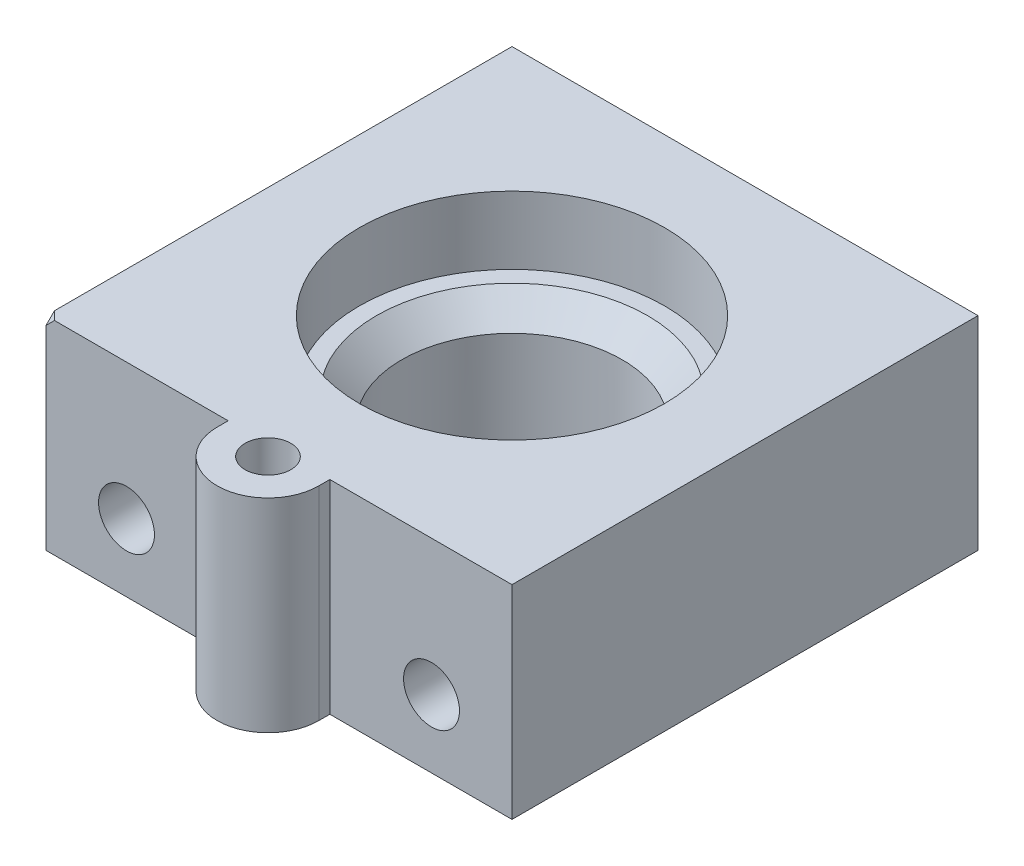
ISO-10303-21;
HEADER;
FILE_DESCRIPTION(('STEP AP214'),'2;1');
FILE_NAME('part.step','',(''),(''),'','','');
FILE_SCHEMA(('AUTOMOTIVE_DESIGN { 1 0 10303 214 1 1 1 1 }'));
ENDSEC;
DATA;
#1=APPLICATION_CONTEXT('core data for automotive mechanical design processes');
#2=APPLICATION_PROTOCOL_DEFINITION('international standard','automotive_design',2000,#1);
#3=PRODUCT_CONTEXT('',#1,'mechanical');
#4=PRODUCT('Part','Part','',(#3));
#5=PRODUCT_RELATED_PRODUCT_CATEGORY('part','',(#4));
#6=PRODUCT_DEFINITION_FORMATION('','',#4);
#7=PRODUCT_DEFINITION_CONTEXT('part definition',#1,'design');
#8=PRODUCT_DEFINITION('design','',#6,#7);
#9=PRODUCT_DEFINITION_SHAPE('','',#8);
#10=(LENGTH_UNIT() NAMED_UNIT(*) SI_UNIT(.MILLI.,.METRE.));
#11=(NAMED_UNIT(*) PLANE_ANGLE_UNIT() SI_UNIT($,.RADIAN.));
#12=(NAMED_UNIT(*) SI_UNIT($,.STERADIAN.) SOLID_ANGLE_UNIT());
#13=UNCERTAINTY_MEASURE_WITH_UNIT(LENGTH_MEASURE(1.E-05),#10,'distance_accuracy_value','');
#14=(GEOMETRIC_REPRESENTATION_CONTEXT(3) GLOBAL_UNCERTAINTY_ASSIGNED_CONTEXT((#13)) GLOBAL_UNIT_ASSIGNED_CONTEXT((#10,
#11,#12)) REPRESENTATION_CONTEXT('',''));
#15=CARTESIAN_POINT('',(0.,0.,0.));
#16=DIRECTION('',(0.,0.,1.));
#17=DIRECTION('',(1.,0.,0.));
#18=AXIS2_PLACEMENT_3D('',#15,#16,#17);
#19=CARTESIAN_POINT('',(-13.75,12.,13.75));
#20=DIRECTION('',(0.,0.,-1.));
#21=DIRECTION('',(-1.,0.,0.));
#22=AXIS2_PLACEMENT_3D('',#19,#20,#21);
#23=PLANE('',#22);
#24=CARTESIAN_POINT('',(-9.,4.,13.75));
#25=DIRECTION('',(0.,0.,1.));
#26=DIRECTION('',(1.,0.,0.));
#27=AXIS2_PLACEMENT_3D('',#24,#25,#26);
#28=CIRCLE('',#27,1.65);
#29=CARTESIAN_POINT('',(-7.35,4.,13.75));
#30=VERTEX_POINT('',#29);
#31=EDGE_CURVE('E143',#30,#30,#28,.T.);
#32=ORIENTED_EDGE('',*,*,#31,.F.);
#33=EDGE_LOOP('',(#32));
#34=FACE_BOUND('',#33,.T.);
#35=DIRECTION('',(0.,-1.,0.));
#36=VECTOR('',#35,1.);
#37=CARTESIAN_POINT('',(-3.,19.022997935355,13.75));
#38=LINE('',#37,#36);
#39=CARTESIAN_POINT('',(-3.,12.,13.75));
#40=VERTEX_POINT('',#39);
#41=CARTESIAN_POINT('',(-3.,0.,13.75));
#42=VERTEX_POINT('',#41);
#43=EDGE_CURVE('E139',#40,#42,#38,.T.);
#44=ORIENTED_EDGE('',*,*,#43,.F.);
#45=DIRECTION('',(1.,0.,0.));
#46=VECTOR('',#45,1.);
#47=CARTESIAN_POINT('',(-13.75,12.,13.75));
#48=LINE('',#47,#46);
#49=CARTESIAN_POINT('',(-13.25,12.,13.75));
#50=VERTEX_POINT('',#49);
#51=EDGE_CURVE('E174',#50,#40,#48,.T.);
#52=ORIENTED_EDGE('',*,*,#51,.F.);
#53=DIRECTION('',(0.707106781186547,0.707106781186547,0.));
#54=VECTOR('',#53,1.);
#55=CARTESIAN_POINT('',(-13.5,11.75,13.75));
#56=LINE('',#55,#54);
#57=CARTESIAN_POINT('',(-13.75,11.5,13.75));
#58=VERTEX_POINT('',#57);
#59=EDGE_CURVE('E43',#58,#50,#56,.T.);
#60=ORIENTED_EDGE('',*,*,#59,.F.);
#61=DIRECTION('',(0.,-1.,0.));
#62=VECTOR('',#61,1.);
#63=CARTESIAN_POINT('',(-13.75,12.,13.75));
#64=LINE('',#63,#62);
#65=CARTESIAN_POINT('',(-13.75,0.,13.75));
#66=VERTEX_POINT('',#65);
#67=EDGE_CURVE('E188',#58,#66,#64,.T.);
#68=ORIENTED_EDGE('',*,*,#67,.T.);
#69=DIRECTION('',(1.,0.,0.));
#70=VECTOR('',#69,1.);
#71=CARTESIAN_POINT('',(-13.75,0.,13.75));
#72=LINE('',#71,#70);
#73=EDGE_CURVE('E169',#66,#42,#72,.T.);
#74=ORIENTED_EDGE('',*,*,#73,.T.);
#75=EDGE_LOOP('',(#44,#52,#60,#68,#74));
#76=FACE_BOUND('',#75,.T.);
#77=ADVANCED_FACE('F35',(#34,#76),#23,.F.);
#78=CARTESIAN_POINT('',(13.75,12.,13.75));
#79=DIRECTION('',(-1.,0.,0.));
#80=DIRECTION('',(0.,0.,1.));
#81=AXIS2_PLACEMENT_3D('',#78,#79,#80);
#82=PLANE('',#81);
#83=DIRECTION('',(0.,0.,-1.));
#84=VECTOR('',#83,1.);
#85=CARTESIAN_POINT('',(13.75,0.,13.75));
#86=LINE('',#85,#84);
#87=CARTESIAN_POINT('',(13.75,0.,13.75));
#88=VERTEX_POINT('',#87);
#89=CARTESIAN_POINT('',(13.75,0.,-13.75));
#90=VERTEX_POINT('',#89);
#91=EDGE_CURVE('E162',#88,#90,#86,.T.);
#92=ORIENTED_EDGE('',*,*,#91,.T.);
#93=DIRECTION('',(0.,-1.,0.));
#94=VECTOR('',#93,1.);
#95=CARTESIAN_POINT('',(13.75,12.,-13.75));
#96=LINE('',#95,#94);
#97=CARTESIAN_POINT('',(13.75,12.,-13.75));
#98=VERTEX_POINT('',#97);
#99=EDGE_CURVE('E193',#98,#90,#96,.T.);
#100=ORIENTED_EDGE('',*,*,#99,.F.);
#101=DIRECTION('',(0.,0.,-1.));
#102=VECTOR('',#101,1.);
#103=CARTESIAN_POINT('',(13.75,12.,13.75));
#104=LINE('',#103,#102);
#105=CARTESIAN_POINT('',(13.75,12.,13.75));
#106=VERTEX_POINT('',#105);
#107=EDGE_CURVE('E165',#106,#98,#104,.T.);
#108=ORIENTED_EDGE('',*,*,#107,.F.);
#109=DIRECTION('',(0.,-1.,0.));
#110=VECTOR('',#109,1.);
#111=CARTESIAN_POINT('',(13.75,12.,13.75));
#112=LINE('',#111,#110);
#113=EDGE_CURVE('E176',#106,#88,#112,.T.);
#114=ORIENTED_EDGE('',*,*,#113,.T.);
#115=EDGE_LOOP('',(#92,#100,#108,#114));
#116=FACE_BOUND('',#115,.T.);
#117=ADVANCED_FACE('F232',(#116),#82,.F.);
#118=CARTESIAN_POINT('',(-13.75,12.,-13.75));
#119=DIRECTION('',(0.,0.,1.));
#120=DIRECTION('',(1.,0.,0.));
#121=AXIS2_PLACEMENT_3D('',#118,#119,#120);
#122=PLANE('',#121);
#123=CARTESIAN_POINT('',(-9.,4.,-13.75));
#124=DIRECTION('',(0.,0.,1.));
#125=DIRECTION('',(1.,0.,0.));
#126=AXIS2_PLACEMENT_3D('',#123,#124,#125);
#127=CIRCLE('',#126,1.65);
#128=CARTESIAN_POINT('',(-7.35,4.,-13.75));
#129=VERTEX_POINT('',#128);
#130=EDGE_CURVE('E146',#129,#129,#127,.F.);
#131=ORIENTED_EDGE('',*,*,#130,.F.);
#132=EDGE_LOOP('',(#131));
#133=FACE_BOUND('',#132,.T.);
#134=CARTESIAN_POINT('',(9.,4.,-13.75));
#135=DIRECTION('',(0.,0.,1.));
#136=DIRECTION('',(1.,0.,0.));
#137=AXIS2_PLACEMENT_3D('',#134,#135,#136);
#138=CIRCLE('',#137,1.65);
#139=CARTESIAN_POINT('',(10.65,4.,-13.75));
#140=VERTEX_POINT('',#139);
#141=EDGE_CURVE('E147',#140,#140,#138,.F.);
#142=ORIENTED_EDGE('',*,*,#141,.F.);
#143=EDGE_LOOP('',(#142));
#144=FACE_BOUND('',#143,.T.);
#145=DIRECTION('',(-1.,0.,0.));
#146=VECTOR('',#145,1.);
#147=CARTESIAN_POINT('',(-13.75,0.,-13.75));
#148=LINE('',#147,#146);
#149=CARTESIAN_POINT('',(-13.75,0.,-13.75));
#150=VERTEX_POINT('',#149);
#151=EDGE_CURVE('E179',#90,#150,#148,.T.);
#152=ORIENTED_EDGE('',*,*,#151,.T.);
#153=DIRECTION('',(0.,-1.,0.));
#154=VECTOR('',#153,1.);
#155=CARTESIAN_POINT('',(-13.75,12.,-13.75));
#156=LINE('',#155,#154);
#157=CARTESIAN_POINT('',(-13.75,12.,-13.75));
#158=VERTEX_POINT('',#157);
#159=EDGE_CURVE('E190',#158,#150,#156,.T.);
#160=ORIENTED_EDGE('',*,*,#159,.F.);
#161=DIRECTION('',(-1.,0.,0.));
#162=VECTOR('',#161,1.);
#163=CARTESIAN_POINT('',(-13.75,12.,-13.75));
#164=LINE('',#163,#162);
#165=EDGE_CURVE('E168',#98,#158,#164,.T.);
#166=ORIENTED_EDGE('',*,*,#165,.F.);
#167=ORIENTED_EDGE('',*,*,#99,.T.);
#168=EDGE_LOOP('',(#152,#160,#166,#167));
#169=FACE_BOUND('',#168,.T.);
#170=ADVANCED_FACE('F241',(#133,#144,#169),#122,.F.);
#171=CARTESIAN_POINT('',(-13.75,12.,13.75));
#172=DIRECTION('',(1.,0.,0.));
#173=DIRECTION('',(0.,0.,-1.));
#174=AXIS2_PLACEMENT_3D('',#171,#172,#173);
#175=PLANE('',#174);
#176=DIRECTION('',(0.,-0.707106781186547,0.707106781186547));
#177=VECTOR('',#176,1.);
#178=CARTESIAN_POINT('',(-13.75,11.75,13.5));
#179=LINE('',#178,#177);
#180=CARTESIAN_POINT('',(-13.75,12.,13.25));
#181=VERTEX_POINT('',#180);
#182=EDGE_CURVE('E202',#181,#58,#179,.T.);
#183=ORIENTED_EDGE('',*,*,#182,.F.);
#184=DIRECTION('',(0.,0.,1.));
#185=VECTOR('',#184,1.);
#186=CARTESIAN_POINT('',(-13.75,12.,13.75));
#187=LINE('',#186,#185);
#188=EDGE_CURVE('E171',#158,#181,#187,.T.);
#189=ORIENTED_EDGE('',*,*,#188,.F.);
#190=ORIENTED_EDGE('',*,*,#159,.T.);
#191=DIRECTION('',(0.,0.,1.));
#192=VECTOR('',#191,1.);
#193=CARTESIAN_POINT('',(-13.75,0.,13.75));
#194=LINE('',#193,#192);
#195=EDGE_CURVE('E181',#150,#66,#194,.T.);
#196=ORIENTED_EDGE('',*,*,#195,.T.);
#197=ORIENTED_EDGE('',*,*,#67,.F.);
#198=EDGE_LOOP('',(#183,#189,#190,#196,#197));
#199=FACE_BOUND('',#198,.T.);
#200=ADVANCED_FACE('F212',(#199),#175,.F.);
#201=CARTESIAN_POINT('',(3.,12.,13.75));
#202=VERTEX_POINT('',#201);
#203=EDGE_CURVE('E173',#202,#106,#48,.T.);
#204=ORIENTED_EDGE('',*,*,#203,.F.);
#205=DIRECTION('',(0.,-1.,0.));
#206=VECTOR('',#205,1.);
#207=CARTESIAN_POINT('',(3.,19.022997935355,13.75));
#208=LINE('',#207,#206);
#209=CARTESIAN_POINT('',(3.,0.,13.75));
#210=VERTEX_POINT('',#209);
#211=EDGE_CURVE('E112',#202,#210,#208,.T.);
#212=ORIENTED_EDGE('',*,*,#211,.T.);
#213=EDGE_CURVE('E121',#210,#88,#72,.T.);
#214=ORIENTED_EDGE('',*,*,#213,.T.);
#215=ORIENTED_EDGE('',*,*,#113,.F.);
#216=EDGE_LOOP('',(#204,#212,#214,#215));
#217=FACE_BOUND('',#216,.T.);
#218=CARTESIAN_POINT('',(9.,4.,13.75));
#219=DIRECTION('',(0.,0.,1.));
#220=DIRECTION('',(1.,0.,0.));
#221=AXIS2_PLACEMENT_3D('',#218,#219,#220);
#222=CIRCLE('',#221,1.65);
#223=CARTESIAN_POINT('',(10.65,4.,13.75));
#224=VERTEX_POINT('',#223);
#225=EDGE_CURVE('E151',#224,#224,#222,.T.);
#226=ORIENTED_EDGE('',*,*,#225,.F.);
#227=EDGE_LOOP('',(#226));
#228=FACE_BOUND('',#227,.T.);
#229=ADVANCED_FACE('F235',(#217,#228),#23,.F.);
#230=CARTESIAN_POINT('',(0.,12.,0.));
#231=DIRECTION('',(0.,-1.,0.));
#232=DIRECTION('',(0.,0.,-1.));
#233=AXIS2_PLACEMENT_3D('',#230,#231,#232);
#234=PLANE('',#233);
#235=CARTESIAN_POINT('',(0.,12.,14.4));
#236=DIRECTION('',(0.,1.,0.));
#237=DIRECTION('',(0.,0.,1.));
#238=AXIS2_PLACEMENT_3D('',#235,#236,#237);
#239=CIRCLE('',#238,1.35);
#240=CARTESIAN_POINT('',(0.,12.,15.75));
#241=VERTEX_POINT('',#240);
#242=EDGE_CURVE('E128',#241,#241,#239,.T.);
#243=ORIENTED_EDGE('',*,*,#242,.F.);
#244=EDGE_LOOP('',(#243));
#245=FACE_BOUND('',#244,.T.);
#246=DIRECTION('',(-0.707106781186547,0.,-0.707106781186547));
#247=VECTOR('',#246,1.);
#248=CARTESIAN_POINT('',(-13.5,12.,13.5));
#249=LINE('',#248,#247);
#250=EDGE_CURVE('E11',#50,#181,#249,.T.);
#251=ORIENTED_EDGE('',*,*,#250,.F.);
#252=ORIENTED_EDGE('',*,*,#51,.T.);
#253=DIRECTION('',(0.,0.,-1.));
#254=VECTOR('',#253,1.);
#255=CARTESIAN_POINT('',(-3.,12.,14.4));
#256=LINE('',#255,#254);
#257=CARTESIAN_POINT('',(-3.,12.,14.4));
#258=VERTEX_POINT('',#257);
#259=EDGE_CURVE('E111',#258,#40,#256,.T.);
#260=ORIENTED_EDGE('',*,*,#259,.F.);
#261=CARTESIAN_POINT('',(0.,12.,14.4));
#262=DIRECTION('',(0.,-1.,0.));
#263=DIRECTION('',(0.,0.,-1.));
#264=AXIS2_PLACEMENT_3D('',#261,#262,#263);
#265=CIRCLE('',#264,3.);
#266=CARTESIAN_POINT('',(3.,12.,14.4));
#267=VERTEX_POINT('',#266);
#268=EDGE_CURVE('E134',#267,#258,#265,.T.);
#269=ORIENTED_EDGE('',*,*,#268,.F.);
#270=DIRECTION('',(0.,0.,1.));
#271=VECTOR('',#270,1.);
#272=CARTESIAN_POINT('',(3.,12.,13.75));
#273=LINE('',#272,#271);
#274=EDGE_CURVE('E107',#202,#267,#273,.T.);
#275=ORIENTED_EDGE('',*,*,#274,.F.);
#276=ORIENTED_EDGE('',*,*,#203,.T.);
#277=ORIENTED_EDGE('',*,*,#107,.T.);
#278=ORIENTED_EDGE('',*,*,#165,.T.);
#279=ORIENTED_EDGE('',*,*,#188,.T.);
#280=EDGE_LOOP('',(#251,#252,#260,#269,#275,#276,#277,#278,#279));
#281=FACE_BOUND('',#280,.T.);
#282=CARTESIAN_POINT('',(0.,12.,0.));
#283=DIRECTION('',(0.,1.,0.));
#284=DIRECTION('',(0.,0.,1.));
#285=AXIS2_PLACEMENT_3D('',#282,#283,#284);
#286=CIRCLE('',#285,9.);
#287=CARTESIAN_POINT('',(0.,12.,9.));
#288=VERTEX_POINT('',#287);
#289=EDGE_CURVE('E158',#288,#288,#286,.T.);
#290=ORIENTED_EDGE('',*,*,#289,.F.);
#291=EDGE_LOOP('',(#290));
#292=FACE_BOUND('',#291,.T.);
#293=ADVANCED_FACE('F218',(#245,#281,#292),#234,.F.);
#294=CARTESIAN_POINT('',(0.,0.,0.));
#295=DIRECTION('',(0.,-1.,0.));
#296=DIRECTION('',(0.,0.,-1.));
#297=AXIS2_PLACEMENT_3D('',#294,#295,#296);
#298=PLANE('',#297);
#299=CARTESIAN_POINT('',(0.,0.,14.4));
#300=DIRECTION('',(0.,-1.,0.));
#301=DIRECTION('',(0.,0.,-1.));
#302=AXIS2_PLACEMENT_3D('',#299,#300,#301);
#303=CIRCLE('',#302,1.35);
#304=CARTESIAN_POINT('',(0.,0.,13.05));
#305=VERTEX_POINT('',#304);
#306=EDGE_CURVE('E131',#305,#305,#303,.F.);
#307=ORIENTED_EDGE('',*,*,#306,.T.);
#308=EDGE_LOOP('',(#307));
#309=FACE_BOUND('',#308,.T.);
#310=CARTESIAN_POINT('',(0.,0.,0.));
#311=DIRECTION('',(0.,-1.,0.));
#312=DIRECTION('',(0.,0.,-1.));
#313=AXIS2_PLACEMENT_3D('',#310,#311,#312);
#314=CIRCLE('',#313,6.5);
#315=CARTESIAN_POINT('',(0.,0.,-6.5));
#316=VERTEX_POINT('',#315);
#317=EDGE_CURVE('E150',#316,#316,#314,.F.);
#318=ORIENTED_EDGE('',*,*,#317,.T.);
#319=EDGE_LOOP('',(#318));
#320=FACE_BOUND('',#319,.T.);
#321=ORIENTED_EDGE('',*,*,#91,.F.);
#322=ORIENTED_EDGE('',*,*,#213,.F.);
#323=DIRECTION('',(0.,0.,-1.));
#324=VECTOR('',#323,1.);
#325=CARTESIAN_POINT('',(3.,0.,13.75));
#326=LINE('',#325,#324);
#327=CARTESIAN_POINT('',(3.,0.,14.4));
#328=VERTEX_POINT('',#327);
#329=EDGE_CURVE('E50',#328,#210,#326,.T.);
#330=ORIENTED_EDGE('',*,*,#329,.F.);
#331=CARTESIAN_POINT('',(0.,0.,14.4));
#332=DIRECTION('',(0.,1.,0.));
#333=DIRECTION('',(0.,0.,1.));
#334=AXIS2_PLACEMENT_3D('',#331,#332,#333);
#335=CIRCLE('',#334,3.);
#336=CARTESIAN_POINT('',(-3.,0.,14.4));
#337=VERTEX_POINT('',#336);
#338=EDGE_CURVE('E120',#337,#328,#335,.T.);
#339=ORIENTED_EDGE('',*,*,#338,.F.);
#340=DIRECTION('',(0.,0.,1.));
#341=VECTOR('',#340,1.);
#342=CARTESIAN_POINT('',(-3.,0.,14.4));
#343=LINE('',#342,#341);
#344=EDGE_CURVE('E122',#42,#337,#343,.T.);
#345=ORIENTED_EDGE('',*,*,#344,.F.);
#346=ORIENTED_EDGE('',*,*,#73,.F.);
#347=ORIENTED_EDGE('',*,*,#195,.F.);
#348=ORIENTED_EDGE('',*,*,#151,.F.);
#349=EDGE_LOOP('',(#321,#322,#330,#339,#345,#346,#347,#348));
#350=FACE_BOUND('',#349,.T.);
#351=ADVANCED_FACE('F118',(#309,#320,#350),#298,.T.);
#352=CARTESIAN_POINT('',(0.,8.,0.));
#353=DIRECTION('',(0.,1.,0.));
#354=DIRECTION('',(0.,0.,1.));
#355=AXIS2_PLACEMENT_3D('',#352,#353,#354);
#356=CYLINDRICAL_SURFACE('',#355,9.);
#357=CARTESIAN_POINT('',(0.,8.,0.));
#358=DIRECTION('',(0.,1.,0.));
#359=DIRECTION('',(0.,0.,1.));
#360=AXIS2_PLACEMENT_3D('',#357,#358,#359);
#361=CIRCLE('',#360,9.);
#362=CARTESIAN_POINT('',(0.,8.,9.));
#363=VERTEX_POINT('',#362);
#364=EDGE_CURVE('E159',#363,#363,#361,.T.);
#365=ORIENTED_EDGE('',*,*,#364,.F.);
#366=EDGE_LOOP('',(#365));
#367=FACE_BOUND('',#366,.T.);
#368=ORIENTED_EDGE('',*,*,#289,.T.);
#369=EDGE_LOOP('',(#368));
#370=FACE_BOUND('',#369,.T.);
#371=ADVANCED_FACE('F298',(#367,#370),#356,.F.);
#372=CARTESIAN_POINT('',(0.,8.,0.));
#373=DIRECTION('',(0.,1.,0.));
#374=DIRECTION('',(0.,0.,1.));
#375=AXIS2_PLACEMENT_3D('',#372,#373,#374);
#376=PLANE('',#375);
#377=CARTESIAN_POINT('',(0.,8.,0.));
#378=DIRECTION('',(0.,1.,0.));
#379=DIRECTION('',(0.,0.,1.));
#380=AXIS2_PLACEMENT_3D('',#377,#378,#379);
#381=CIRCLE('',#380,8.00000000000001);
#382=CARTESIAN_POINT('',(0.,8.,8.00000000000001));
#383=VERTEX_POINT('',#382);
#384=EDGE_CURVE('E199',#383,#383,#381,.F.);
#385=ORIENTED_EDGE('',*,*,#384,.T.);
#386=EDGE_LOOP('',(#385));
#387=FACE_BOUND('',#386,.T.);
#388=ORIENTED_EDGE('',*,*,#364,.T.);
#389=EDGE_LOOP('',(#388));
#390=FACE_BOUND('',#389,.T.);
#391=ADVANCED_FACE('F294',(#387,#390),#376,.T.);
#392=CARTESIAN_POINT('',(0.,-0.000999999999999265,0.));
#393=DIRECTION('',(0.,1.,0.));
#394=DIRECTION('',(0.,0.,1.));
#395=AXIS2_PLACEMENT_3D('',#392,#393,#394);
#396=CYLINDRICAL_SURFACE('',#395,6.5);
#397=CARTESIAN_POINT('',(0.,6.5,0.));
#398=DIRECTION('',(0.,1.,0.));
#399=DIRECTION('',(0.,0.,1.));
#400=AXIS2_PLACEMENT_3D('',#397,#398,#399);
#401=CIRCLE('',#400,6.5);
#402=CARTESIAN_POINT('',(0.,6.5,6.5));
#403=VERTEX_POINT('',#402);
#404=EDGE_CURVE('E196',#403,#403,#401,.T.);
#405=ORIENTED_EDGE('',*,*,#404,.T.);
#406=EDGE_LOOP('',(#405));
#407=FACE_BOUND('',#406,.T.);
#408=ORIENTED_EDGE('',*,*,#317,.F.);
#409=EDGE_LOOP('',(#408));
#410=FACE_BOUND('',#409,.T.);
#411=ADVANCED_FACE('F262',(#407,#410),#396,.F.);
#412=CARTESIAN_POINT('',(9.,4.,-13.751));
#413=DIRECTION('',(0.,0.,1.));
#414=DIRECTION('',(1.,0.,0.));
#415=AXIS2_PLACEMENT_3D('',#412,#413,#414);
#416=CYLINDRICAL_SURFACE('',#415,1.65);
#417=ORIENTED_EDGE('',*,*,#225,.T.);
#418=EDGE_LOOP('',(#417));
#419=FACE_BOUND('',#418,.T.);
#420=ORIENTED_EDGE('',*,*,#141,.T.);
#421=EDGE_LOOP('',(#420));
#422=FACE_BOUND('',#421,.T.);
#423=ADVANCED_FACE('F258',(#419,#422),#416,.F.);
#424=CARTESIAN_POINT('',(-9.,4.,-13.751));
#425=DIRECTION('',(0.,0.,1.));
#426=DIRECTION('',(1.,0.,0.));
#427=AXIS2_PLACEMENT_3D('',#424,#425,#426);
#428=CYLINDRICAL_SURFACE('',#427,1.65);
#429=ORIENTED_EDGE('',*,*,#31,.T.);
#430=EDGE_LOOP('',(#429));
#431=FACE_BOUND('',#430,.T.);
#432=ORIENTED_EDGE('',*,*,#130,.T.);
#433=EDGE_LOOP('',(#432));
#434=FACE_BOUND('',#433,.T.);
#435=ADVANCED_FACE('F261',(#431,#434),#428,.F.);
#436=CARTESIAN_POINT('',(0.,6.5,0.));
#437=DIRECTION('',(0.,1.,0.));
#438=DIRECTION('',(0.,0.,1.));
#439=AXIS2_PLACEMENT_3D('',#436,#437,#438);
#440=CONICAL_SURFACE('',#439,6.5,0.785398163397451);
#441=ORIENTED_EDGE('',*,*,#384,.F.);
#442=EDGE_LOOP('',(#441));
#443=FACE_BOUND('',#442,.T.);
#444=ORIENTED_EDGE('',*,*,#404,.F.);
#445=EDGE_LOOP('',(#444));
#446=FACE_BOUND('',#445,.T.);
#447=ADVANCED_FACE('F37',(#443,#446),#440,.F.);
#448=CARTESIAN_POINT('',(-13.,13.,13.));
#449=DIRECTION('',(-0.577350269189626,0.577350269189626,0.577350269189626));
#450=DIRECTION('',(0.707106781186547,0.,0.707106781186547));
#451=AXIS2_PLACEMENT_3D('',#448,#449,#450);
#452=PLANE('',#451);
#453=ORIENTED_EDGE('',*,*,#250,.T.);
#454=ORIENTED_EDGE('',*,*,#182,.T.);
#455=ORIENTED_EDGE('',*,*,#59,.T.);
#456=EDGE_LOOP('',(#453,#454,#455));
#457=FACE_BOUND('',#456,.T.);
#458=ADVANCED_FACE('F206',(#457),#452,.T.);
#459=CARTESIAN_POINT('',(-3.,19.022997935355,14.4));
#460=DIRECTION('',(1.,0.,0.));
#461=DIRECTION('',(0.,0.,-1.));
#462=AXIS2_PLACEMENT_3D('',#459,#460,#461);
#463=PLANE('',#462);
#464=DIRECTION('',(0.,-1.,0.));
#465=VECTOR('',#464,1.);
#466=CARTESIAN_POINT('',(-3.,19.022997935355,14.4));
#467=LINE('',#466,#465);
#468=EDGE_CURVE('E126',#258,#337,#467,.T.);
#469=ORIENTED_EDGE('',*,*,#468,.F.);
#470=ORIENTED_EDGE('',*,*,#259,.T.);
#471=ORIENTED_EDGE('',*,*,#43,.T.);
#472=ORIENTED_EDGE('',*,*,#344,.T.);
#473=EDGE_LOOP('',(#469,#470,#471,#472));
#474=FACE_BOUND('',#473,.T.);
#475=ADVANCED_FACE('F220',(#474),#463,.F.);
#476=CARTESIAN_POINT('',(3.,19.022997935355,13.75));
#477=DIRECTION('',(-1.,0.,0.));
#478=DIRECTION('',(0.,0.,1.));
#479=AXIS2_PLACEMENT_3D('',#476,#477,#478);
#480=PLANE('',#479);
#481=ORIENTED_EDGE('',*,*,#211,.F.);
#482=ORIENTED_EDGE('',*,*,#274,.T.);
#483=DIRECTION('',(0.,-1.,0.));
#484=VECTOR('',#483,1.);
#485=CARTESIAN_POINT('',(3.,19.022997935355,14.4));
#486=LINE('',#485,#484);
#487=EDGE_CURVE('E105',#267,#328,#486,.T.);
#488=ORIENTED_EDGE('',*,*,#487,.T.);
#489=ORIENTED_EDGE('',*,*,#329,.T.);
#490=EDGE_LOOP('',(#481,#482,#488,#489));
#491=FACE_BOUND('',#490,.T.);
#492=ADVANCED_FACE('F106',(#491),#480,.F.);
#493=CARTESIAN_POINT('',(0.,19.022997935355,14.4));
#494=DIRECTION('',(0.,-1.,0.));
#495=DIRECTION('',(0.,0.,-1.));
#496=AXIS2_PLACEMENT_3D('',#493,#494,#495);
#497=CYLINDRICAL_SURFACE('',#496,3.);
#498=ORIENTED_EDGE('',*,*,#487,.F.);
#499=ORIENTED_EDGE('',*,*,#268,.T.);
#500=ORIENTED_EDGE('',*,*,#468,.T.);
#501=ORIENTED_EDGE('',*,*,#338,.T.);
#502=EDGE_LOOP('',(#498,#499,#500,#501));
#503=FACE_BOUND('',#502,.T.);
#504=ADVANCED_FACE('F124',(#503),#497,.T.);
#505=CARTESIAN_POINT('',(0.,-0.000999999999999265,14.4));
#506=DIRECTION('',(0.,1.,0.));
#507=DIRECTION('',(0.,0.,1.));
#508=AXIS2_PLACEMENT_3D('',#505,#506,#507);
#509=CYLINDRICAL_SURFACE('',#508,1.35);
#510=ORIENTED_EDGE('',*,*,#306,.F.);
#511=EDGE_LOOP('',(#510));
#512=FACE_BOUND('',#511,.T.);
#513=ORIENTED_EDGE('',*,*,#242,.T.);
#514=EDGE_LOOP('',(#513));
#515=FACE_BOUND('',#514,.T.);
#516=ADVANCED_FACE('F278',(#512,#515),#509,.F.);
#517=CLOSED_SHELL('',(#77,#117,#170,#200,#229,#293,#351,#371,#391,#411,#423,#435,#447,#458,#475,
#492,#504,#516));
#518=MANIFOLD_SOLID_BREP('B2',#517);
#519=ADVANCED_BREP_SHAPE_REPRESENTATION('',(#18,#518),#14);
#520=SHAPE_DEFINITION_REPRESENTATION(#9,#519);
ENDSEC;
END-ISO-10303-21;
